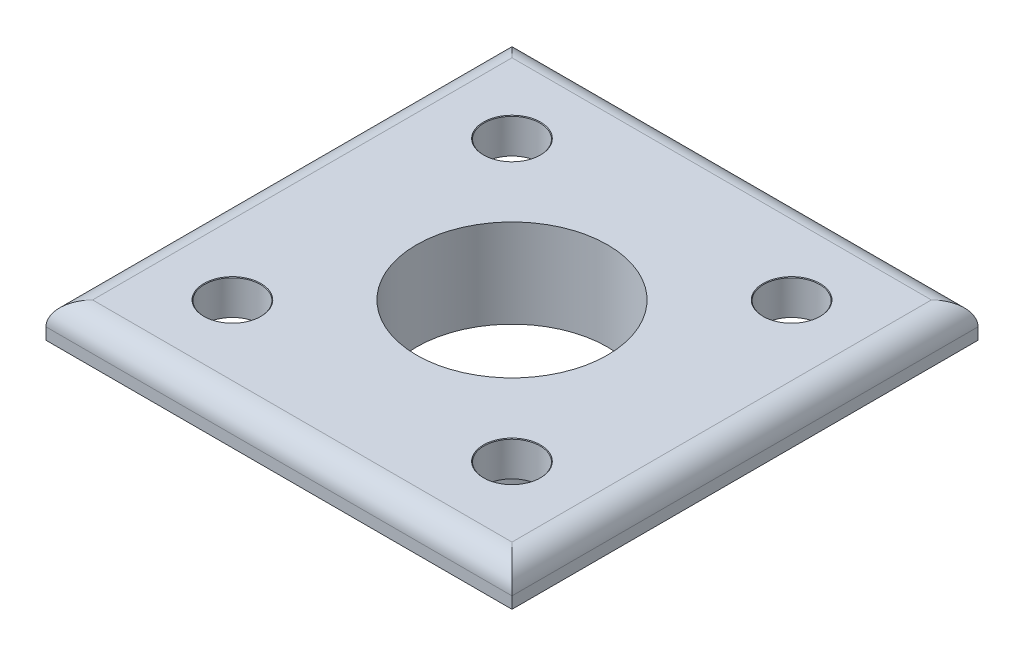
ISO-10303-21;
HEADER;
FILE_DESCRIPTION(('STEP AP214'),'2;1');
FILE_NAME('part.step','',(''),(''),'','','');
FILE_SCHEMA(('AUTOMOTIVE_DESIGN { 1 0 10303 214 1 1 1 1 }'));
ENDSEC;
DATA;
#1=APPLICATION_CONTEXT('core data for automotive mechanical design processes');
#2=APPLICATION_PROTOCOL_DEFINITION('international standard','automotive_design',2000,#1);
#3=PRODUCT_CONTEXT('',#1,'mechanical');
#4=PRODUCT('Part','Part','',(#3));
#5=PRODUCT_RELATED_PRODUCT_CATEGORY('part','',(#4));
#6=PRODUCT_DEFINITION_FORMATION('','',#4);
#7=PRODUCT_DEFINITION_CONTEXT('part definition',#1,'design');
#8=PRODUCT_DEFINITION('design','',#6,#7);
#9=PRODUCT_DEFINITION_SHAPE('','',#8);
#10=(LENGTH_UNIT() NAMED_UNIT(*) SI_UNIT(.MILLI.,.METRE.));
#11=(NAMED_UNIT(*) PLANE_ANGLE_UNIT() SI_UNIT($,.RADIAN.));
#12=(NAMED_UNIT(*) SI_UNIT($,.STERADIAN.) SOLID_ANGLE_UNIT());
#13=UNCERTAINTY_MEASURE_WITH_UNIT(LENGTH_MEASURE(1.E-05),#10,'distance_accuracy_value','');
#14=(GEOMETRIC_REPRESENTATION_CONTEXT(3) GLOBAL_UNCERTAINTY_ASSIGNED_CONTEXT((#13)) GLOBAL_UNIT_ASSIGNED_CONTEXT((#10,
#11,#12)) REPRESENTATION_CONTEXT('',''));
#15=CARTESIAN_POINT('',(0.,0.,0.));
#16=DIRECTION('',(0.,0.,1.));
#17=DIRECTION('',(1.,0.,0.));
#18=AXIS2_PLACEMENT_3D('',#15,#16,#17);
#19=CARTESIAN_POINT('',(0.,1.5,0.));
#20=DIRECTION('',(0.,-1.,0.));
#21=DIRECTION('',(0.,0.,-1.));
#22=AXIS2_PLACEMENT_3D('',#19,#20,#21);
#23=PLANE('',#22);
#24=CARTESIAN_POINT('',(0.,1.5,0.));
#25=DIRECTION('',(0.,1.,0.));
#26=DIRECTION('',(0.,0.,1.));
#27=AXIS2_PLACEMENT_3D('',#24,#25,#26);
#28=CIRCLE('',#27,4.1);
#29=CARTESIAN_POINT('',(0.,1.5,4.1));
#30=VERTEX_POINT('',#29);
#31=EDGE_CURVE('E161',#30,#30,#28,.T.);
#32=ORIENTED_EDGE('',*,*,#31,.F.);
#33=EDGE_LOOP('',(#32));
#34=FACE_BOUND('',#33,.T.);
#35=DIRECTION('',(0.,0.,1.));
#36=VECTOR('',#35,1.);
#37=CARTESIAN_POINT('',(-9.,1.5,0.));
#38=LINE('',#37,#36);
#39=CARTESIAN_POINT('',(-9.,1.5,-9.));
#40=VERTEX_POINT('',#39);
#41=CARTESIAN_POINT('',(-9.,1.5,9.));
#42=VERTEX_POINT('',#41);
#43=EDGE_CURVE('E114',#40,#42,#38,.T.);
#44=ORIENTED_EDGE('',*,*,#43,.T.);
#45=DIRECTION('',(1.,0.,0.));
#46=VECTOR('',#45,1.);
#47=CARTESIAN_POINT('',(0.,1.5,9.));
#48=LINE('',#47,#46);
#49=CARTESIAN_POINT('',(9.,1.5,9.));
#50=VERTEX_POINT('',#49);
#51=EDGE_CURVE('E148',#42,#50,#48,.T.);
#52=ORIENTED_EDGE('',*,*,#51,.T.);
#53=DIRECTION('',(0.,0.,-1.));
#54=VECTOR('',#53,1.);
#55=CARTESIAN_POINT('',(9.,1.5,0.));
#56=LINE('',#55,#54);
#57=CARTESIAN_POINT('',(9.,1.5,-9.));
#58=VERTEX_POINT('',#57);
#59=EDGE_CURVE('E146',#50,#58,#56,.T.);
#60=ORIENTED_EDGE('',*,*,#59,.T.);
#61=DIRECTION('',(-1.,0.,0.));
#62=VECTOR('',#61,1.);
#63=CARTESIAN_POINT('',(0.,1.5,-9.));
#64=LINE('',#63,#62);
#65=EDGE_CURVE('E144',#58,#40,#64,.T.);
#66=ORIENTED_EDGE('',*,*,#65,.T.);
#67=EDGE_LOOP('',(#44,#52,#60,#66));
#68=FACE_BOUND('',#67,.T.);
#69=CARTESIAN_POINT('',(6.,1.5,6.));
#70=DIRECTION('',(0.,1.,0.));
#71=DIRECTION('',(0.,0.,1.));
#72=AXIS2_PLACEMENT_3D('',#69,#70,#71);
#73=CIRCLE('',#72,1.225);
#74=CARTESIAN_POINT('',(6.,1.5,7.225));
#75=VERTEX_POINT('',#74);
#76=EDGE_CURVE('E243',#75,#75,#73,.T.);
#77=ORIENTED_EDGE('',*,*,#76,.F.);
#78=EDGE_LOOP('',(#77));
#79=FACE_BOUND('',#78,.T.);
#80=CARTESIAN_POINT('',(-6.,1.5,6.));
#81=DIRECTION('',(0.,1.,0.));
#82=DIRECTION('',(0.,0.,1.));
#83=AXIS2_PLACEMENT_3D('',#80,#81,#82);
#84=CIRCLE('',#83,1.225);
#85=CARTESIAN_POINT('',(-6.,1.5,7.225));
#86=VERTEX_POINT('',#85);
#87=EDGE_CURVE('E247',#86,#86,#84,.T.);
#88=ORIENTED_EDGE('',*,*,#87,.F.);
#89=EDGE_LOOP('',(#88));
#90=FACE_BOUND('',#89,.T.);
#91=CARTESIAN_POINT('',(6.,1.5,-6.));
#92=DIRECTION('',(0.,1.,0.));
#93=DIRECTION('',(0.,0.,1.));
#94=AXIS2_PLACEMENT_3D('',#91,#92,#93);
#95=CIRCLE('',#94,1.225);
#96=CARTESIAN_POINT('',(6.,1.5,-4.775));
#97=VERTEX_POINT('',#96);
#98=EDGE_CURVE('E251',#97,#97,#95,.T.);
#99=ORIENTED_EDGE('',*,*,#98,.F.);
#100=EDGE_LOOP('',(#99));
#101=FACE_BOUND('',#100,.T.);
#102=CARTESIAN_POINT('',(-6.,1.5,-6.));
#103=DIRECTION('',(0.,1.,0.));
#104=DIRECTION('',(0.,0.,1.));
#105=AXIS2_PLACEMENT_3D('',#102,#103,#104);
#106=CIRCLE('',#105,1.225);
#107=CARTESIAN_POINT('',(-6.,1.5,-4.775));
#108=VERTEX_POINT('',#107);
#109=EDGE_CURVE('E168',#108,#108,#106,.T.);
#110=ORIENTED_EDGE('',*,*,#109,.F.);
#111=EDGE_LOOP('',(#110));
#112=FACE_BOUND('',#111,.T.);
#113=ADVANCED_FACE('F53',(#34,#68,#79,#90,#101,#112),#23,.F.);
#114=CARTESIAN_POINT('',(10.,1.5,10.));
#115=DIRECTION('',(-1.,0.,0.));
#116=DIRECTION('',(0.,0.,1.));
#117=AXIS2_PLACEMENT_3D('',#114,#115,#116);
#118=PLANE('',#117);
#119=DIRECTION('',(0.,-1.,0.));
#120=VECTOR('',#119,1.);
#121=CARTESIAN_POINT('',(10.,1.5,-10.));
#122=LINE('',#121,#120);
#123=CARTESIAN_POINT('',(10.,0.5,-10.));
#124=VERTEX_POINT('',#123);
#125=CARTESIAN_POINT('',(10.,0.,-10.));
#126=VERTEX_POINT('',#125);
#127=EDGE_CURVE('E106',#124,#126,#122,.T.);
#128=ORIENTED_EDGE('',*,*,#127,.F.);
#129=DIRECTION('',(0.,0.,-1.));
#130=VECTOR('',#129,1.);
#131=CARTESIAN_POINT('',(10.,0.5,10.));
#132=LINE('',#131,#130);
#133=CARTESIAN_POINT('',(10.,0.5,10.));
#134=VERTEX_POINT('',#133);
#135=EDGE_CURVE('E154',#124,#134,#132,.F.);
#136=ORIENTED_EDGE('',*,*,#135,.T.);
#137=DIRECTION('',(0.,-1.,0.));
#138=VECTOR('',#137,1.);
#139=CARTESIAN_POINT('',(10.,1.5,10.));
#140=LINE('',#139,#138);
#141=CARTESIAN_POINT('',(10.,0.,10.));
#142=VERTEX_POINT('',#141);
#143=EDGE_CURVE('E127',#134,#142,#140,.T.);
#144=ORIENTED_EDGE('',*,*,#143,.T.);
#145=DIRECTION('',(0.,0.,-1.));
#146=VECTOR('',#145,1.);
#147=CARTESIAN_POINT('',(10.,0.,10.));
#148=LINE('',#147,#146);
#149=EDGE_CURVE('E121',#142,#126,#148,.T.);
#150=ORIENTED_EDGE('',*,*,#149,.T.);
#151=EDGE_LOOP('',(#128,#136,#144,#150));
#152=FACE_BOUND('',#151,.T.);
#153=ADVANCED_FACE('F125',(#152),#118,.F.);
#154=CARTESIAN_POINT('',(-10.,1.5,-10.));
#155=DIRECTION('',(0.,0.,1.));
#156=DIRECTION('',(1.,0.,0.));
#157=AXIS2_PLACEMENT_3D('',#154,#155,#156);
#158=PLANE('',#157);
#159=DIRECTION('',(0.,-1.,0.));
#160=VECTOR('',#159,1.);
#161=CARTESIAN_POINT('',(-10.,1.5,-10.));
#162=LINE('',#161,#160);
#163=CARTESIAN_POINT('',(-10.,0.5,-10.));
#164=VERTEX_POINT('',#163);
#165=CARTESIAN_POINT('',(-10.,0.,-10.));
#166=VERTEX_POINT('',#165);
#167=EDGE_CURVE('E115',#164,#166,#162,.T.);
#168=ORIENTED_EDGE('',*,*,#167,.F.);
#169=DIRECTION('',(-1.,0.,0.));
#170=VECTOR('',#169,1.);
#171=CARTESIAN_POINT('',(-10.,0.5,-10.));
#172=LINE('',#171,#170);
#173=EDGE_CURVE('E76',#164,#124,#172,.F.);
#174=ORIENTED_EDGE('',*,*,#173,.T.);
#175=ORIENTED_EDGE('',*,*,#127,.T.);
#176=DIRECTION('',(-1.,0.,0.));
#177=VECTOR('',#176,1.);
#178=CARTESIAN_POINT('',(-10.,0.,-10.));
#179=LINE('',#178,#177);
#180=EDGE_CURVE('E109',#126,#166,#179,.T.);
#181=ORIENTED_EDGE('',*,*,#180,.T.);
#182=EDGE_LOOP('',(#168,#174,#175,#181));
#183=FACE_BOUND('',#182,.T.);
#184=ADVANCED_FACE('F108',(#183),#158,.F.);
#185=CARTESIAN_POINT('',(-10.,1.5,10.));
#186=DIRECTION('',(1.,0.,0.));
#187=DIRECTION('',(0.,0.,-1.));
#188=AXIS2_PLACEMENT_3D('',#185,#186,#187);
#189=PLANE('',#188);
#190=DIRECTION('',(0.,-1.,0.));
#191=VECTOR('',#190,1.);
#192=CARTESIAN_POINT('',(-10.,1.5,10.));
#193=LINE('',#192,#191);
#194=CARTESIAN_POINT('',(-10.,0.5,10.));
#195=VERTEX_POINT('',#194);
#196=CARTESIAN_POINT('',(-10.,0.,10.));
#197=VERTEX_POINT('',#196);
#198=EDGE_CURVE('E140',#195,#197,#193,.T.);
#199=ORIENTED_EDGE('',*,*,#198,.F.);
#200=DIRECTION('',(0.,0.,1.));
#201=VECTOR('',#200,1.);
#202=CARTESIAN_POINT('',(-10.,0.5,10.));
#203=LINE('',#202,#201);
#204=EDGE_CURVE('E69',#195,#164,#203,.F.);
#205=ORIENTED_EDGE('',*,*,#204,.T.);
#206=ORIENTED_EDGE('',*,*,#167,.T.);
#207=DIRECTION('',(0.,0.,1.));
#208=VECTOR('',#207,1.);
#209=CARTESIAN_POINT('',(-10.,0.,10.));
#210=LINE('',#209,#208);
#211=EDGE_CURVE('E123',#166,#197,#210,.T.);
#212=ORIENTED_EDGE('',*,*,#211,.T.);
#213=EDGE_LOOP('',(#199,#205,#206,#212));
#214=FACE_BOUND('',#213,.T.);
#215=ADVANCED_FACE('F203',(#214),#189,.F.);
#216=CARTESIAN_POINT('',(-10.,1.5,10.));
#217=DIRECTION('',(0.,0.,-1.));
#218=DIRECTION('',(-1.,0.,0.));
#219=AXIS2_PLACEMENT_3D('',#216,#217,#218);
#220=PLANE('',#219);
#221=ORIENTED_EDGE('',*,*,#143,.F.);
#222=DIRECTION('',(1.,0.,0.));
#223=VECTOR('',#222,1.);
#224=CARTESIAN_POINT('',(-10.,0.5,10.));
#225=LINE('',#224,#223);
#226=EDGE_CURVE('E151',#134,#195,#225,.F.);
#227=ORIENTED_EDGE('',*,*,#226,.T.);
#228=ORIENTED_EDGE('',*,*,#198,.T.);
#229=DIRECTION('',(1.,0.,0.));
#230=VECTOR('',#229,1.);
#231=CARTESIAN_POINT('',(-10.,0.,10.));
#232=LINE('',#231,#230);
#233=EDGE_CURVE('E137',#197,#142,#232,.T.);
#234=ORIENTED_EDGE('',*,*,#233,.T.);
#235=EDGE_LOOP('',(#221,#227,#228,#234));
#236=FACE_BOUND('',#235,.T.);
#237=ADVANCED_FACE('F199',(#236),#220,.F.);
#238=CARTESIAN_POINT('',(0.,0.,0.));
#239=DIRECTION('',(0.,-1.,0.));
#240=DIRECTION('',(0.,0.,-1.));
#241=AXIS2_PLACEMENT_3D('',#238,#239,#240);
#242=PLANE('',#241);
#243=CARTESIAN_POINT('',(0.,0.,0.));
#244=DIRECTION('',(0.,-1.,0.));
#245=DIRECTION('',(0.,0.,-1.));
#246=AXIS2_PLACEMENT_3D('',#243,#244,#245);
#247=CIRCLE('',#246,5.45);
#248=CARTESIAN_POINT('',(0.,0.,-5.45));
#249=VERTEX_POINT('',#248);
#250=EDGE_CURVE('E320',#249,#249,#247,.T.);
#251=ORIENTED_EDGE('',*,*,#250,.F.);
#252=EDGE_LOOP('',(#251));
#253=FACE_BOUND('',#252,.T.);
#254=CARTESIAN_POINT('',(-6.,0.,-6.));
#255=DIRECTION('',(0.,-1.,0.));
#256=DIRECTION('',(0.,0.,-1.));
#257=AXIS2_PLACEMENT_3D('',#254,#255,#256);
#258=CIRCLE('',#257,1.2);
#259=CARTESIAN_POINT('',(-6.,0.,-7.2));
#260=VERTEX_POINT('',#259);
#261=EDGE_CURVE('E258',#260,#260,#258,.T.);
#262=ORIENTED_EDGE('',*,*,#261,.F.);
#263=EDGE_LOOP('',(#262));
#264=FACE_BOUND('',#263,.T.);
#265=CARTESIAN_POINT('',(6.,0.,-6.));
#266=DIRECTION('',(0.,-1.,0.));
#267=DIRECTION('',(0.,0.,-1.));
#268=AXIS2_PLACEMENT_3D('',#265,#266,#267);
#269=CIRCLE('',#268,1.2);
#270=CARTESIAN_POINT('',(6.,0.,-7.2));
#271=VERTEX_POINT('',#270);
#272=EDGE_CURVE('E269',#271,#271,#269,.T.);
#273=ORIENTED_EDGE('',*,*,#272,.F.);
#274=EDGE_LOOP('',(#273));
#275=FACE_BOUND('',#274,.T.);
#276=CARTESIAN_POINT('',(-6.,0.,6.));
#277=DIRECTION('',(0.,-1.,0.));
#278=DIRECTION('',(0.,0.,-1.));
#279=AXIS2_PLACEMENT_3D('',#276,#277,#278);
#280=CIRCLE('',#279,1.2);
#281=CARTESIAN_POINT('',(-6.,0.,4.8));
#282=VERTEX_POINT('',#281);
#283=EDGE_CURVE('E276',#282,#282,#280,.T.);
#284=ORIENTED_EDGE('',*,*,#283,.F.);
#285=EDGE_LOOP('',(#284));
#286=FACE_BOUND('',#285,.T.);
#287=CARTESIAN_POINT('',(6.,0.,6.));
#288=DIRECTION('',(0.,-1.,0.));
#289=DIRECTION('',(0.,0.,-1.));
#290=AXIS2_PLACEMENT_3D('',#287,#288,#289);
#291=CIRCLE('',#290,1.2);
#292=CARTESIAN_POINT('',(6.,0.,4.8));
#293=VERTEX_POINT('',#292);
#294=EDGE_CURVE('E129',#293,#293,#291,.T.);
#295=ORIENTED_EDGE('',*,*,#294,.F.);
#296=EDGE_LOOP('',(#295));
#297=FACE_BOUND('',#296,.T.);
#298=ORIENTED_EDGE('',*,*,#149,.F.);
#299=ORIENTED_EDGE('',*,*,#233,.F.);
#300=ORIENTED_EDGE('',*,*,#211,.F.);
#301=ORIENTED_EDGE('',*,*,#180,.F.);
#302=EDGE_LOOP('',(#298,#299,#300,#301));
#303=FACE_BOUND('',#302,.T.);
#304=ADVANCED_FACE('F119',(#253,#264,#275,#286,#297,#303),#242,.T.);
#305=CARTESIAN_POINT('',(6.,1.5,6.));
#306=DIRECTION('',(0.,1.,0.));
#307=DIRECTION('',(0.,0.,1.));
#308=AXIS2_PLACEMENT_3D('',#305,#306,#307);
#309=CYLINDRICAL_SURFACE('',#308,1.2);
#310=CARTESIAN_POINT('',(6.,1.475,6.));
#311=DIRECTION('',(0.,1.,0.));
#312=DIRECTION('',(0.,0.,1.));
#313=AXIS2_PLACEMENT_3D('',#310,#311,#312);
#314=CIRCLE('',#313,1.2);
#315=CARTESIAN_POINT('',(6.,1.475,7.2));
#316=VERTEX_POINT('',#315);
#317=EDGE_CURVE('E132',#316,#316,#314,.T.);
#318=ORIENTED_EDGE('',*,*,#317,.T.);
#319=EDGE_LOOP('',(#318));
#320=FACE_BOUND('',#319,.T.);
#321=ORIENTED_EDGE('',*,*,#294,.T.);
#322=EDGE_LOOP('',(#321));
#323=FACE_BOUND('',#322,.T.);
#324=ADVANCED_FACE('F196',(#320,#323),#309,.F.);
#325=CARTESIAN_POINT('',(6.,1.5,6.));
#326=DIRECTION('',(0.,1.,0.));
#327=DIRECTION('',(0.,0.,1.));
#328=AXIS2_PLACEMENT_3D('',#325,#326,#327);
#329=CONICAL_SURFACE('',#328,1.225,0.785398163397453);
#330=ORIENTED_EDGE('',*,*,#317,.F.);
#331=EDGE_LOOP('',(#330));
#332=FACE_BOUND('',#331,.T.);
#333=ORIENTED_EDGE('',*,*,#76,.T.);
#334=EDGE_LOOP('',(#333));
#335=FACE_BOUND('',#334,.T.);
#336=ADVANCED_FACE('F284',(#332,#335),#329,.F.);
#337=CARTESIAN_POINT('',(-6.,1.5,6.));
#338=DIRECTION('',(0.,1.,0.));
#339=DIRECTION('',(0.,0.,1.));
#340=AXIS2_PLACEMENT_3D('',#337,#338,#339);
#341=CYLINDRICAL_SURFACE('',#340,1.2);
#342=CARTESIAN_POINT('',(-6.,1.475,6.));
#343=DIRECTION('',(0.,1.,0.));
#344=DIRECTION('',(0.,0.,1.));
#345=AXIS2_PLACEMENT_3D('',#342,#343,#344);
#346=CIRCLE('',#345,1.2);
#347=CARTESIAN_POINT('',(-6.,1.475,7.2));
#348=VERTEX_POINT('',#347);
#349=EDGE_CURVE('E273',#348,#348,#346,.T.);
#350=ORIENTED_EDGE('',*,*,#349,.T.);
#351=EDGE_LOOP('',(#350));
#352=FACE_BOUND('',#351,.T.);
#353=ORIENTED_EDGE('',*,*,#283,.T.);
#354=EDGE_LOOP('',(#353));
#355=FACE_BOUND('',#354,.T.);
#356=ADVANCED_FACE('F287',(#352,#355),#341,.F.);
#357=CARTESIAN_POINT('',(-6.,1.5,6.));
#358=DIRECTION('',(0.,1.,0.));
#359=DIRECTION('',(0.,0.,1.));
#360=AXIS2_PLACEMENT_3D('',#357,#358,#359);
#361=CONICAL_SURFACE('',#360,1.225,0.785398163397453);
#362=ORIENTED_EDGE('',*,*,#349,.F.);
#363=EDGE_LOOP('',(#362));
#364=FACE_BOUND('',#363,.T.);
#365=ORIENTED_EDGE('',*,*,#87,.T.);
#366=EDGE_LOOP('',(#365));
#367=FACE_BOUND('',#366,.T.);
#368=ADVANCED_FACE('F292',(#364,#367),#361,.F.);
#369=CARTESIAN_POINT('',(6.,1.5,-6.));
#370=DIRECTION('',(0.,1.,0.));
#371=DIRECTION('',(0.,0.,1.));
#372=AXIS2_PLACEMENT_3D('',#369,#370,#371);
#373=CYLINDRICAL_SURFACE('',#372,1.2);
#374=CARTESIAN_POINT('',(6.,1.475,-6.));
#375=DIRECTION('',(0.,1.,0.));
#376=DIRECTION('',(0.,0.,1.));
#377=AXIS2_PLACEMENT_3D('',#374,#375,#376);
#378=CIRCLE('',#377,1.2);
#379=CARTESIAN_POINT('',(6.,1.475,-4.8));
#380=VERTEX_POINT('',#379);
#381=EDGE_CURVE('E266',#380,#380,#378,.T.);
#382=ORIENTED_EDGE('',*,*,#381,.T.);
#383=EDGE_LOOP('',(#382));
#384=FACE_BOUND('',#383,.T.);
#385=ORIENTED_EDGE('',*,*,#272,.T.);
#386=EDGE_LOOP('',(#385));
#387=FACE_BOUND('',#386,.T.);
#388=ADVANCED_FACE('F298',(#384,#387),#373,.F.);
#389=CARTESIAN_POINT('',(6.,1.5,-6.));
#390=DIRECTION('',(0.,1.,0.));
#391=DIRECTION('',(0.,0.,1.));
#392=AXIS2_PLACEMENT_3D('',#389,#390,#391);
#393=CONICAL_SURFACE('',#392,1.225,0.785398163397453);
#394=ORIENTED_EDGE('',*,*,#381,.F.);
#395=EDGE_LOOP('',(#394));
#396=FACE_BOUND('',#395,.T.);
#397=ORIENTED_EDGE('',*,*,#98,.T.);
#398=EDGE_LOOP('',(#397));
#399=FACE_BOUND('',#398,.T.);
#400=ADVANCED_FACE('F302',(#396,#399),#393,.F.);
#401=CARTESIAN_POINT('',(-6.,1.5,-6.));
#402=DIRECTION('',(0.,1.,0.));
#403=DIRECTION('',(0.,0.,1.));
#404=AXIS2_PLACEMENT_3D('',#401,#402,#403);
#405=CYLINDRICAL_SURFACE('',#404,1.2);
#406=CARTESIAN_POINT('',(-6.,1.475,-6.));
#407=DIRECTION('',(0.,1.,0.));
#408=DIRECTION('',(0.,0.,1.));
#409=AXIS2_PLACEMENT_3D('',#406,#407,#408);
#410=CIRCLE('',#409,1.2);
#411=CARTESIAN_POINT('',(-6.,1.475,-4.8));
#412=VERTEX_POINT('',#411);
#413=EDGE_CURVE('E255',#412,#412,#410,.T.);
#414=ORIENTED_EDGE('',*,*,#413,.T.);
#415=EDGE_LOOP('',(#414));
#416=FACE_BOUND('',#415,.T.);
#417=ORIENTED_EDGE('',*,*,#261,.T.);
#418=EDGE_LOOP('',(#417));
#419=FACE_BOUND('',#418,.T.);
#420=ADVANCED_FACE('F227',(#416,#419),#405,.F.);
#421=CARTESIAN_POINT('',(-6.,1.5,-6.));
#422=DIRECTION('',(0.,1.,0.));
#423=DIRECTION('',(0.,0.,1.));
#424=AXIS2_PLACEMENT_3D('',#421,#422,#423);
#425=CONICAL_SURFACE('',#424,1.225,0.785398163397453);
#426=ORIENTED_EDGE('',*,*,#413,.F.);
#427=EDGE_LOOP('',(#426));
#428=FACE_BOUND('',#427,.T.);
#429=ORIENTED_EDGE('',*,*,#109,.T.);
#430=EDGE_LOOP('',(#429));
#431=FACE_BOUND('',#430,.T.);
#432=ADVANCED_FACE('F222',(#428,#431),#425,.F.);
#433=CARTESIAN_POINT('',(0.,0.5,-9.));
#434=DIRECTION('',(-1.,0.,0.));
#435=DIRECTION('',(0.,0.,1.));
#436=AXIS2_PLACEMENT_3D('',#433,#434,#435);
#437=CYLINDRICAL_SURFACE('',#436,1.);
#438=CARTESIAN_POINT('',(9.,0.5,-9.));
#439=DIRECTION('',(-0.707106781186547,0.,-0.707106781186547));
#440=DIRECTION('',(-0.707106781186547,0.,0.707106781186547));
#441=AXIS2_PLACEMENT_3D('',#438,#439,#440);
#442=ELLIPSE('',#441,1.41421356237309,1.);
#443=EDGE_CURVE('E163',#124,#58,#442,.F.);
#444=ORIENTED_EDGE('',*,*,#443,.F.);
#445=ORIENTED_EDGE('',*,*,#173,.F.);
#446=CARTESIAN_POINT('',(-9.,0.5,-9.));
#447=DIRECTION('',(-0.707106781186547,0.,0.707106781186547));
#448=DIRECTION('',(0.707106781186547,0.,0.707106781186547));
#449=AXIS2_PLACEMENT_3D('',#446,#447,#448);
#450=ELLIPSE('',#449,1.41421356237309,1.);
#451=EDGE_CURVE('E166',#40,#164,#450,.T.);
#452=ORIENTED_EDGE('',*,*,#451,.F.);
#453=ORIENTED_EDGE('',*,*,#65,.F.);
#454=EDGE_LOOP('',(#444,#445,#452,#453));
#455=FACE_BOUND('',#454,.T.);
#456=ADVANCED_FACE('F219',(#455),#437,.T.);
#457=CARTESIAN_POINT('',(-9.,0.5,0.));
#458=DIRECTION('',(0.,0.,1.));
#459=DIRECTION('',(1.,0.,0.));
#460=AXIS2_PLACEMENT_3D('',#457,#458,#459);
#461=CYLINDRICAL_SURFACE('',#460,1.);
#462=ORIENTED_EDGE('',*,*,#451,.T.);
#463=ORIENTED_EDGE('',*,*,#204,.F.);
#464=CARTESIAN_POINT('',(-9.,0.5,9.));
#465=DIRECTION('',(0.707106781186547,0.,0.707106781186547));
#466=DIRECTION('',(-0.707106781186547,0.,0.707106781186547));
#467=AXIS2_PLACEMENT_3D('',#464,#465,#466);
#468=ELLIPSE('',#467,1.41421356237309,1.);
#469=EDGE_CURVE('E160',#42,#195,#468,.T.);
#470=ORIENTED_EDGE('',*,*,#469,.F.);
#471=ORIENTED_EDGE('',*,*,#43,.F.);
#472=EDGE_LOOP('',(#462,#463,#470,#471));
#473=FACE_BOUND('',#472,.T.);
#474=ADVANCED_FACE('F216',(#473),#461,.T.);
#475=CARTESIAN_POINT('',(9.,0.5,0.));
#476=DIRECTION('',(0.,0.,-1.));
#477=DIRECTION('',(-1.,0.,0.));
#478=AXIS2_PLACEMENT_3D('',#475,#476,#477);
#479=CYLINDRICAL_SURFACE('',#478,1.);
#480=ORIENTED_EDGE('',*,*,#443,.T.);
#481=ORIENTED_EDGE('',*,*,#59,.F.);
#482=CARTESIAN_POINT('',(9.,0.5,9.));
#483=DIRECTION('',(0.707106781186547,0.,-0.707106781186547));
#484=DIRECTION('',(-0.707106781186547,0.,-0.707106781186547));
#485=AXIS2_PLACEMENT_3D('',#482,#483,#484);
#486=ELLIPSE('',#485,1.41421356237309,1.);
#487=EDGE_CURVE('E158',#134,#50,#486,.F.);
#488=ORIENTED_EDGE('',*,*,#487,.F.);
#489=ORIENTED_EDGE('',*,*,#135,.F.);
#490=EDGE_LOOP('',(#480,#481,#488,#489));
#491=FACE_BOUND('',#490,.T.);
#492=ADVANCED_FACE('F212',(#491),#479,.T.);
#493=CARTESIAN_POINT('',(0.,0.5,9.));
#494=DIRECTION('',(1.,0.,0.));
#495=DIRECTION('',(0.,0.,-1.));
#496=AXIS2_PLACEMENT_3D('',#493,#494,#495);
#497=CYLINDRICAL_SURFACE('',#496,1.);
#498=ORIENTED_EDGE('',*,*,#469,.T.);
#499=ORIENTED_EDGE('',*,*,#226,.F.);
#500=ORIENTED_EDGE('',*,*,#487,.T.);
#501=ORIENTED_EDGE('',*,*,#51,.F.);
#502=EDGE_LOOP('',(#498,#499,#500,#501));
#503=FACE_BOUND('',#502,.T.);
#504=ADVANCED_FACE('F209',(#503),#497,.T.);
#505=CARTESIAN_POINT('',(0.,-0.000999999999999916,0.));
#506=DIRECTION('',(0.,1.,0.));
#507=DIRECTION('',(0.,0.,1.));
#508=AXIS2_PLACEMENT_3D('',#505,#506,#507);
#509=CYLINDRICAL_SURFACE('',#508,4.1);
#510=ORIENTED_EDGE('',*,*,#31,.T.);
#511=EDGE_LOOP('',(#510));
#512=FACE_BOUND('',#511,.T.);
#513=CARTESIAN_POINT('',(0.,-2.3,0.));
#514=DIRECTION('',(0.,-1.,0.));
#515=DIRECTION('',(0.,0.,-1.));
#516=AXIS2_PLACEMENT_3D('',#513,#514,#515);
#517=CIRCLE('',#516,4.1);
#518=CARTESIAN_POINT('',(0.,-2.3,-4.1));
#519=VERTEX_POINT('',#518);
#520=EDGE_CURVE('E321',#519,#519,#517,.F.);
#521=ORIENTED_EDGE('',*,*,#520,.F.);
#522=EDGE_LOOP('',(#521));
#523=FACE_BOUND('',#522,.T.);
#524=ADVANCED_FACE('F211',(#512,#523),#509,.F.);
#525=CARTESIAN_POINT('',(0.,-2.3,0.));
#526=DIRECTION('',(0.,1.,0.));
#527=DIRECTION('',(0.,0.,1.));
#528=AXIS2_PLACEMENT_3D('',#525,#526,#527);
#529=CYLINDRICAL_SURFACE('',#528,5.45);
#530=CARTESIAN_POINT('',(0.,-1.8,0.));
#531=DIRECTION('',(0.,-1.,0.));
#532=DIRECTION('',(0.,0.,-1.));
#533=AXIS2_PLACEMENT_3D('',#530,#531,#532);
#534=CIRCLE('',#533,5.45);
#535=CARTESIAN_POINT('',(0.,-1.8,-5.45));
#536=VERTEX_POINT('',#535);
#537=EDGE_CURVE('E11',#536,#536,#534,.F.);
#538=ORIENTED_EDGE('',*,*,#537,.T.);
#539=EDGE_LOOP('',(#538));
#540=FACE_BOUND('',#539,.T.);
#541=ORIENTED_EDGE('',*,*,#250,.T.);
#542=EDGE_LOOP('',(#541));
#543=FACE_BOUND('',#542,.T.);
#544=ADVANCED_FACE('F180',(#540,#543),#529,.T.);
#545=CARTESIAN_POINT('',(0.,-2.3,0.));
#546=DIRECTION('',(0.,-1.,0.));
#547=DIRECTION('',(0.,0.,-1.));
#548=AXIS2_PLACEMENT_3D('',#545,#546,#547);
#549=PLANE('',#548);
#550=CARTESIAN_POINT('',(0.,-2.3,0.));
#551=DIRECTION('',(0.,-1.,0.));
#552=DIRECTION('',(0.,0.,-1.));
#553=AXIS2_PLACEMENT_3D('',#550,#551,#552);
#554=CIRCLE('',#553,4.95);
#555=CARTESIAN_POINT('',(0.,-2.3,-4.95));
#556=VERTEX_POINT('',#555);
#557=EDGE_CURVE('E62',#556,#556,#554,.T.);
#558=ORIENTED_EDGE('',*,*,#557,.T.);
#559=EDGE_LOOP('',(#558));
#560=FACE_BOUND('',#559,.T.);
#561=ORIENTED_EDGE('',*,*,#520,.T.);
#562=EDGE_LOOP('',(#561));
#563=FACE_BOUND('',#562,.T.);
#564=ADVANCED_FACE('F172',(#560,#563),#549,.T.);
#565=CARTESIAN_POINT('',(0.,-2.3,0.));
#566=DIRECTION('',(0.,1.,0.));
#567=DIRECTION('',(0.,0.,1.));
#568=AXIS2_PLACEMENT_3D('',#565,#566,#567);
#569=CONICAL_SURFACE('',#568,4.95,0.785398163397447);
#570=ORIENTED_EDGE('',*,*,#537,.F.);
#571=EDGE_LOOP('',(#570));
#572=FACE_BOUND('',#571,.T.);
#573=ORIENTED_EDGE('',*,*,#557,.F.);
#574=EDGE_LOOP('',(#573));
#575=FACE_BOUND('',#574,.T.);
#576=ADVANCED_FACE('F56',(#572,#575),#569,.T.);
#577=CLOSED_SHELL('',(#113,#153,#184,#215,#237,#304,#324,#336,#356,#368,#388,#400,#420,#432,
#456,#474,#492,#504,#524,#544,#564,#576));
#578=MANIFOLD_SOLID_BREP('B2',#577);
#579=ADVANCED_BREP_SHAPE_REPRESENTATION('',(#18,#578),#14);
#580=SHAPE_DEFINITION_REPRESENTATION(#9,#579);
ENDSEC;
END-ISO-10303-21;
